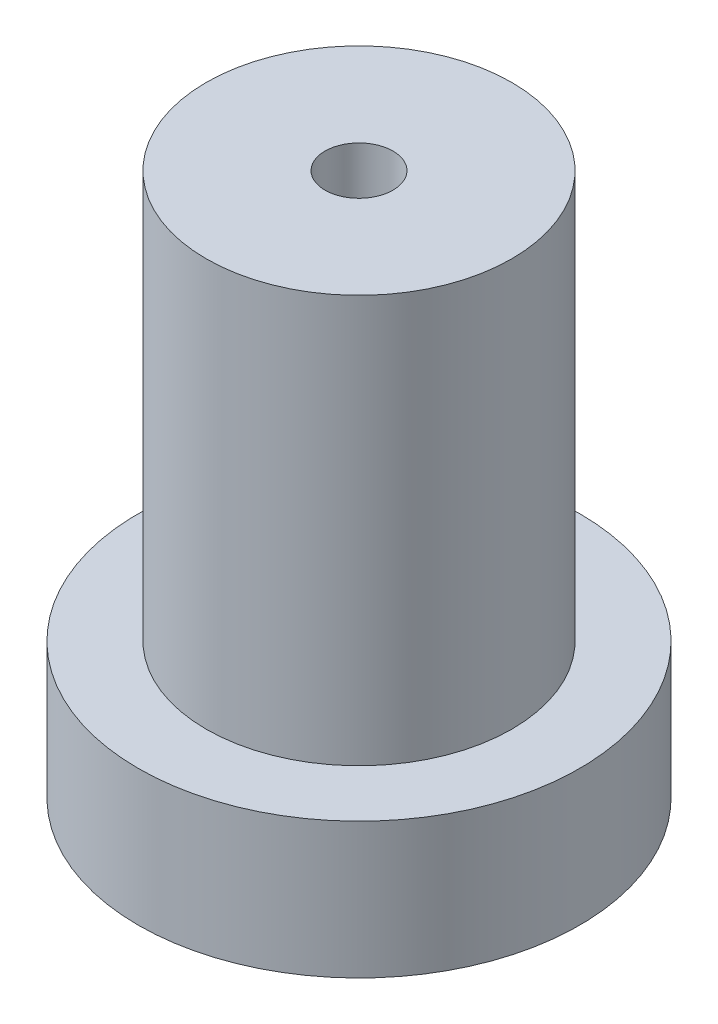
ISO-10303-21;
HEADER;
FILE_DESCRIPTION(('STEP AP214'),'2;1');
FILE_NAME('part.step','',(''),(''),'','','');
FILE_SCHEMA(('AUTOMOTIVE_DESIGN { 1 0 10303 214 1 1 1 1 }'));
ENDSEC;
DATA;
#1=APPLICATION_CONTEXT('core data for automotive mechanical design processes');
#2=APPLICATION_PROTOCOL_DEFINITION('international standard','automotive_design',2000,#1);
#3=PRODUCT_CONTEXT('',#1,'mechanical');
#4=PRODUCT('Part','Part','',(#3));
#5=PRODUCT_RELATED_PRODUCT_CATEGORY('part','',(#4));
#6=PRODUCT_DEFINITION_FORMATION('','',#4);
#7=PRODUCT_DEFINITION_CONTEXT('part definition',#1,'design');
#8=PRODUCT_DEFINITION('design','',#6,#7);
#9=PRODUCT_DEFINITION_SHAPE('','',#8);
#10=(LENGTH_UNIT() NAMED_UNIT(*) SI_UNIT(.MILLI.,.METRE.));
#11=(NAMED_UNIT(*) PLANE_ANGLE_UNIT() SI_UNIT($,.RADIAN.));
#12=(NAMED_UNIT(*) SI_UNIT($,.STERADIAN.) SOLID_ANGLE_UNIT());
#13=UNCERTAINTY_MEASURE_WITH_UNIT(LENGTH_MEASURE(1.E-05),#10,'distance_accuracy_value','');
#14=(GEOMETRIC_REPRESENTATION_CONTEXT(3) GLOBAL_UNCERTAINTY_ASSIGNED_CONTEXT((#13)) GLOBAL_UNIT_ASSIGNED_CONTEXT((#10,
#11,#12)) REPRESENTATION_CONTEXT('',''));
#15=CARTESIAN_POINT('',(0.,0.,0.));
#16=DIRECTION('',(0.,0.,1.));
#17=DIRECTION('',(1.,0.,0.));
#18=AXIS2_PLACEMENT_3D('',#15,#16,#17);
#19=CARTESIAN_POINT('',(0.,14.,0.));
#20=DIRECTION('',(0.,1.,0.));
#21=DIRECTION('',(0.,0.,1.));
#22=AXIS2_PLACEMENT_3D('',#19,#20,#21);
#23=CYLINDRICAL_SURFACE('',#22,6.5);
#24=CARTESIAN_POINT('',(0.,2.,0.));
#25=DIRECTION('',(0.,1.,0.));
#26=DIRECTION('',(0.,0.,1.));
#27=AXIS2_PLACEMENT_3D('',#24,#25,#26);
#28=CIRCLE('',#27,6.5);
#29=CARTESIAN_POINT('',(0.,2.,6.5));
#30=VERTEX_POINT('',#29);
#31=EDGE_CURVE('E10',#30,#30,#28,.T.);
#32=ORIENTED_EDGE('',*,*,#31,.F.);
#33=EDGE_LOOP('',(#32));
#34=FACE_BOUND('',#33,.T.);
#35=CARTESIAN_POINT('',(0.,-2.,0.));
#36=DIRECTION('',(0.,1.,0.));
#37=DIRECTION('',(0.,0.,1.));
#38=AXIS2_PLACEMENT_3D('',#35,#36,#37);
#39=CIRCLE('',#38,6.5);
#40=CARTESIAN_POINT('',(0.,-2.,6.5));
#41=VERTEX_POINT('',#40);
#42=EDGE_CURVE('E46',#41,#41,#39,.T.);
#43=ORIENTED_EDGE('',*,*,#42,.T.);
#44=EDGE_LOOP('',(#43));
#45=FACE_BOUND('',#44,.T.);
#46=ADVANCED_FACE('F32',(#34,#45),#23,.T.);
#47=CARTESIAN_POINT('',(4.5,2.,0.));
#48=DIRECTION('',(0.,-1.,0.));
#49=DIRECTION('',(0.,0.,-1.));
#50=AXIS2_PLACEMENT_3D('',#47,#48,#49);
#51=PLANE('',#50);
#52=CARTESIAN_POINT('',(0.,2.,0.));
#53=DIRECTION('',(0.,1.,0.));
#54=DIRECTION('',(0.,0.,1.));
#55=AXIS2_PLACEMENT_3D('',#52,#53,#54);
#56=CIRCLE('',#55,4.5);
#57=CARTESIAN_POINT('',(0.,2.,4.5));
#58=VERTEX_POINT('',#57);
#59=EDGE_CURVE('E38',#58,#58,#56,.T.);
#60=ORIENTED_EDGE('',*,*,#59,.F.);
#61=EDGE_LOOP('',(#60));
#62=FACE_BOUND('',#61,.T.);
#63=ORIENTED_EDGE('',*,*,#31,.T.);
#64=EDGE_LOOP('',(#63));
#65=FACE_BOUND('',#64,.T.);
#66=ADVANCED_FACE('F74',(#62,#65),#51,.F.);
#67=CARTESIAN_POINT('',(0.,14.,0.));
#68=DIRECTION('',(0.,1.,0.));
#69=DIRECTION('',(0.,0.,1.));
#70=AXIS2_PLACEMENT_3D('',#67,#68,#69);
#71=CYLINDRICAL_SURFACE('',#70,4.5);
#72=CARTESIAN_POINT('',(0.,14.,0.));
#73=DIRECTION('',(0.,1.,0.));
#74=DIRECTION('',(0.,0.,1.));
#75=AXIS2_PLACEMENT_3D('',#72,#73,#74);
#76=CIRCLE('',#75,4.5);
#77=CARTESIAN_POINT('',(0.,14.,4.5));
#78=VERTEX_POINT('',#77);
#79=EDGE_CURVE('E42',#78,#78,#76,.T.);
#80=ORIENTED_EDGE('',*,*,#79,.F.);
#81=EDGE_LOOP('',(#80));
#82=FACE_BOUND('',#81,.T.);
#83=ORIENTED_EDGE('',*,*,#59,.T.);
#84=EDGE_LOOP('',(#83));
#85=FACE_BOUND('',#84,.T.);
#86=ADVANCED_FACE('F79',(#82,#85),#71,.T.);
#87=CARTESIAN_POINT('',(0.,14.,0.));
#88=DIRECTION('',(0.,-1.,0.));
#89=DIRECTION('',(0.,0.,-1.));
#90=AXIS2_PLACEMENT_3D('',#87,#88,#89);
#91=PLANE('',#90);
#92=CARTESIAN_POINT('',(0.,14.,0.));
#93=DIRECTION('',(0.,-1.,0.));
#94=DIRECTION('',(0.,0.,-1.));
#95=AXIS2_PLACEMENT_3D('',#92,#93,#94);
#96=CIRCLE('',#95,1.);
#97=CARTESIAN_POINT('',(0.,14.,-1.));
#98=VERTEX_POINT('',#97);
#99=EDGE_CURVE('E51',#98,#98,#96,.T.);
#100=ORIENTED_EDGE('',*,*,#99,.T.);
#101=EDGE_LOOP('',(#100));
#102=FACE_BOUND('',#101,.T.);
#103=ORIENTED_EDGE('',*,*,#79,.T.);
#104=EDGE_LOOP('',(#103));
#105=FACE_BOUND('',#104,.T.);
#106=ADVANCED_FACE('F58',(#102,#105),#91,.F.);
#107=CARTESIAN_POINT('',(0.,-2.,0.));
#108=DIRECTION('',(0.,1.,0.));
#109=DIRECTION('',(0.,0.,1.));
#110=AXIS2_PLACEMENT_3D('',#107,#108,#109);
#111=PLANE('',#110);
#112=CARTESIAN_POINT('',(0.,-2.,0.));
#113=DIRECTION('',(0.,-1.,0.));
#114=DIRECTION('',(0.,0.,-1.));
#115=AXIS2_PLACEMENT_3D('',#112,#113,#114);
#116=CIRCLE('',#115,1.);
#117=CARTESIAN_POINT('',(0.,-2.,-1.));
#118=VERTEX_POINT('',#117);
#119=EDGE_CURVE('E52',#118,#118,#116,.T.);
#120=ORIENTED_EDGE('',*,*,#119,.F.);
#121=EDGE_LOOP('',(#120));
#122=FACE_BOUND('',#121,.T.);
#123=ORIENTED_EDGE('',*,*,#42,.F.);
#124=EDGE_LOOP('',(#123));
#125=FACE_BOUND('',#124,.T.);
#126=ADVANCED_FACE('F64',(#122,#125),#111,.F.);
#127=CARTESIAN_POINT('',(0.,14.,0.));
#128=DIRECTION('',(0.,-1.,0.));
#129=DIRECTION('',(0.,0.,-1.));
#130=AXIS2_PLACEMENT_3D('',#127,#128,#129);
#131=CYLINDRICAL_SURFACE('',#130,1.);
#132=ORIENTED_EDGE('',*,*,#99,.F.);
#133=EDGE_LOOP('',(#132));
#134=FACE_BOUND('',#133,.T.);
#135=ORIENTED_EDGE('',*,*,#119,.T.);
#136=EDGE_LOOP('',(#135));
#137=FACE_BOUND('',#136,.T.);
#138=ADVANCED_FACE('F61',(#134,#137),#131,.F.);
#139=CLOSED_SHELL('',(#46,#66,#86,#106,#126,#138));
#140=MANIFOLD_SOLID_BREP('B2',#139);
#141=ADVANCED_BREP_SHAPE_REPRESENTATION('',(#18,#140),#14);
#142=SHAPE_DEFINITION_REPRESENTATION(#9,#141);
ENDSEC;
END-ISO-10303-21;
